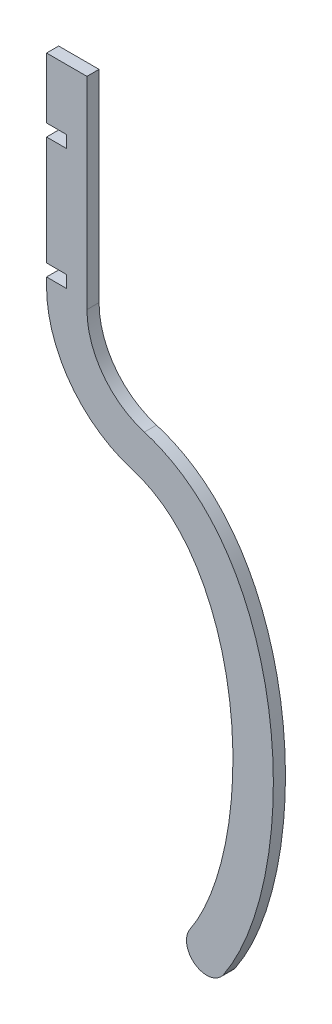
ISO-10303-21;
HEADER;
FILE_DESCRIPTION(('STEP AP214'),'2;1');
FILE_NAME('part.step','',(''),(''),'','','');
FILE_SCHEMA(('AUTOMOTIVE_DESIGN { 1 0 10303 214 1 1 1 1 }'));
ENDSEC;
DATA;
#1=APPLICATION_CONTEXT('core data for automotive mechanical design processes');
#2=APPLICATION_PROTOCOL_DEFINITION('international standard','automotive_design',2000,#1);
#3=PRODUCT_CONTEXT('',#1,'mechanical');
#4=PRODUCT('Part','Part','',(#3));
#5=PRODUCT_RELATED_PRODUCT_CATEGORY('part','',(#4));
#6=PRODUCT_DEFINITION_FORMATION('','',#4);
#7=PRODUCT_DEFINITION_CONTEXT('part definition',#1,'design');
#8=PRODUCT_DEFINITION('design','',#6,#7);
#9=PRODUCT_DEFINITION_SHAPE('','',#8);
#10=(LENGTH_UNIT() NAMED_UNIT(*) SI_UNIT(.MILLI.,.METRE.));
#11=(NAMED_UNIT(*) PLANE_ANGLE_UNIT() SI_UNIT($,.RADIAN.));
#12=(NAMED_UNIT(*) SI_UNIT($,.STERADIAN.) SOLID_ANGLE_UNIT());
#13=UNCERTAINTY_MEASURE_WITH_UNIT(LENGTH_MEASURE(1.E-05),#10,'distance_accuracy_value','');
#14=(GEOMETRIC_REPRESENTATION_CONTEXT(3) GLOBAL_UNCERTAINTY_ASSIGNED_CONTEXT((#13)) GLOBAL_UNIT_ASSIGNED_CONTEXT((#10,
#11,#12)) REPRESENTATION_CONTEXT('',''));
#15=CARTESIAN_POINT('',(0.,0.,0.));
#16=DIRECTION('',(0.,0.,1.));
#17=DIRECTION('',(1.,0.,0.));
#18=AXIS2_PLACEMENT_3D('',#15,#16,#17);
#19=CARTESIAN_POINT('',(74.0467315290024,-64.5312544209873,3.3));
#20=CARTESIAN_POINT('',(74.0467315289976,-64.5312544209945,3.20000000000001));
#21=CARTESIAN_POINT('',(74.0467315290022,-64.5312544209877,3.09999999999999));
#22=CARTESIAN_POINT('',(74.0467315290046,-64.5312544209842,2.00000000000009));
#23=CARTESIAN_POINT('',(74.0467315290024,-64.5312544209874,0.999999999999808));
#24=CARTESIAN_POINT('',(74.0467315290024,-64.5312544209874,-0.0999999999999823));
#25=CARTESIAN_POINT('',(74.0467315289981,-64.5312544209938,-0.200000000000011));
#26=CARTESIAN_POINT('',(74.0467315290024,-64.5312544209874,-0.3));
#27=CARTESIAN_POINT('',(68.4866590624211,-72.8425154908722,3.3));
#28=CARTESIAN_POINT('',(68.4866590624177,-72.8425154908452,3.19999999999999));
#29=CARTESIAN_POINT('',(68.486659062421,-72.8425154908706,3.10000000000001));
#30=CARTESIAN_POINT('',(68.486659062421,-72.8425154909087,1.99999999999987));
#31=CARTESIAN_POINT('',(68.4866590624211,-72.8425154908711,0.999999999999807));
#32=CARTESIAN_POINT('',(68.4866590624211,-72.8425154908711,-0.0999999999999827));
#33=CARTESIAN_POINT('',(68.4866590624128,-72.8425154908569,-0.20000000000001));
#34=CARTESIAN_POINT('',(68.4866590624211,-72.8425154908721,-0.3));
#35=CARTESIAN_POINT('',(60.1752958633945,-67.2825956911554,3.3));
#36=CARTESIAN_POINT('',(60.1752958634181,-67.2825956911443,3.19999999999999));
#37=CARTESIAN_POINT('',(60.1752958633963,-67.2825956911541,3.10000000000001));
#38=CARTESIAN_POINT('',(60.1752958633582,-67.282595691177,1.99999999999987));
#39=CARTESIAN_POINT('',(60.1752958633955,-67.2825956911548,0.999999999999809));
#40=CARTESIAN_POINT('',(60.1752958633955,-67.2825956911548,-0.0999999999999814));
#41=CARTESIAN_POINT('',(60.1752958634054,-67.2825956911442,-0.200000000000012));
#42=CARTESIAN_POINT('',(60.1752958633946,-67.2825956911553,-0.3));
#43=CARTESIAN_POINT('',(65.7350629943711,-58.9711303657911,3.3));
#44=CARTESIAN_POINT('',(65.7350629943658,-58.971130365799,3.20000000000001));
#45=CARTESIAN_POINT('',(65.7350629943709,-58.9711303657914,3.09999999999999));
#46=CARTESIAN_POINT('',(65.7350629943727,-58.9711303657888,2.00000000000009));
#47=CARTESIAN_POINT('',(65.7350629943711,-58.9711303657912,0.999999999999809));
#48=CARTESIAN_POINT('',(65.7350629943711,-58.9711303657912,-0.099999999999981));
#49=CARTESIAN_POINT('',(65.7350629943698,-58.971130365793,-0.200000000000012));
#50=CARTESIAN_POINT('',(65.7350629943711,-58.9711303657912,-0.3));
#51=(BOUNDED_SURFACE() B_SPLINE_SURFACE(3,3,((#19,#20,#21,#22,#23,#24,#25,#26),(#27,#28,#29,#30,
#31,#32,#33,#34),(#35,#36,#37,#38,#39,#40,#41,#42),(#43,#44,#45,#46,#47,#48,#49,#50)),
.UNSPECIFIED.,.F.,.F.,.F.) B_SPLINE_SURFACE_WITH_KNOTS((4,4),(4,2,2,4),(0.,1.),(-0.1,0.,1.,1.1),
.UNSPECIFIED.) GEOMETRIC_REPRESENTATION_ITEM() RATIONAL_B_SPLINE_SURFACE(((1.,1.,1.,1.,1.,1.,1.,
1.),(0.333345579042306,0.333345579042306,0.333345579042245,0.333345579042245,0.333345579042346,
0.333345579042346,0.333345579042311,0.333345579042311),(0.333345579042306,0.333345579042306,
0.333345579042245,0.333345579042245,0.333345579042346,0.333345579042346,0.333345579042311,
0.333345579042311),(1.,1.,1.,1.,1.,1.,1.,1.))) REPRESENTATION_ITEM('') SURFACE());
#52=CARTESIAN_POINT('',(65.7350629943711,-58.9711303657912,2.92300905702092E-13));
#53=DIRECTION('',(0.,0.,1.));
#54=VECTOR('',#53,1.);
#55=LINE('',#52,#54);
#56=CARTESIAN_POINT('',(65.7350629943711,-58.9711303657912,0.));
#57=VERTEX_POINT('',#56);
#58=CARTESIAN_POINT('',(65.7350629943711,-58.9711303657912,3.));
#59=VERTEX_POINT('',#58);
#60=EDGE_CURVE('E327',#57,#59,#55,.T.);
#61=CARTESIAN_POINT('',(65.7350629943711,-58.9711303657912,0.));
#62=CARTESIAN_POINT('',(60.1752958633955,-67.2825956911548,0.));
#63=CARTESIAN_POINT('',(68.4866590624211,-72.8425154908711,0.));
#64=CARTESIAN_POINT('',(74.0467315290024,-64.5312544209874,0.));
#65=(BOUNDED_CURVE() B_SPLINE_CURVE(3,(#61,#62,#63,#64),.UNSPECIFIED.,.F.,
.F.) B_SPLINE_CURVE_WITH_KNOTS((4,4),(0.,1.),
.UNSPECIFIED.) CURVE() GEOMETRIC_REPRESENTATION_ITEM() RATIONAL_B_SPLINE_CURVE((1.,
0.333345579042346,0.333345579042346,1.)) REPRESENTATION_ITEM(''));
#66=CARTESIAN_POINT('',(74.0467315290024,-64.5312544209874,0.));
#67=VERTEX_POINT('',#66);
#68=EDGE_CURVE('E54',#67,#57,#65,.F.);
#69=CARTESIAN_POINT('',(74.0467315290024,-64.5312544209874,2.99999999999987));
#70=DIRECTION('',(0.,0.,-1.));
#71=VECTOR('',#70,1.);
#72=LINE('',#69,#71);
#73=CARTESIAN_POINT('',(74.0467315290024,-64.5312544209874,3.));
#74=VERTEX_POINT('',#73);
#75=EDGE_CURVE('E407',#74,#67,#72,.T.);
#76=CARTESIAN_POINT('',(74.0467315290024,-64.5312544209874,3.));
#77=CARTESIAN_POINT('',(68.486659062421,-72.842515490874,3.));
#78=CARTESIAN_POINT('',(60.1752958633929,-67.2825956911561,3.));
#79=CARTESIAN_POINT('',(65.7350629943711,-58.9711303657912,3.));
#80=(BOUNDED_CURVE() B_SPLINE_CURVE(3,(#76,#77,#78,#79),.UNSPECIFIED.,.F.,
.F.) B_SPLINE_CURVE_WITH_KNOTS((4,4),(0.,1.),
.UNSPECIFIED.) CURVE() GEOMETRIC_REPRESENTATION_ITEM() RATIONAL_B_SPLINE_CURVE((1.,
0.333345579042245,0.333345579042245,1.)) REPRESENTATION_ITEM(''));
#81=EDGE_CURVE('E11',#59,#74,#80,.F.);
#82=ORIENTED_EDGE('',*,*,#60,.F.);
#83=ORIENTED_EDGE('',*,*,#68,.F.);
#84=ORIENTED_EDGE('',*,*,#75,.F.);
#85=ORIENTED_EDGE('',*,*,#81,.F.);
#86=EDGE_LOOP('',(#82,#83,#84,#85));
#87=FACE_BOUND('',#86,.T.);
#88=ADVANCED_FACE('F40',(#87),#51,.T.);
#89=CARTESIAN_POINT('',(30.2472330755642,111.105178128736,3.));
#90=DIRECTION('',(1.,0.,0.));
#91=DIRECTION('',(0.,1.,0.));
#92=AXIS2_PLACEMENT_3D('',#89,#90,#91);
#93=PLANE('',#92);
#94=DIRECTION('',(0.,0.,1.));
#95=VECTOR('',#94,1.);
#96=CARTESIAN_POINT('',(30.2472330755642,63.1051781287361,3.));
#97=LINE('',#96,#95);
#98=CARTESIAN_POINT('',(30.2472330755642,63.1051781287361,0.));
#99=VERTEX_POINT('',#98);
#100=CARTESIAN_POINT('',(30.2472330755642,63.1051781287361,3.));
#101=VERTEX_POINT('',#100);
#102=EDGE_CURVE('E267',#99,#101,#97,.T.);
#103=ORIENTED_EDGE('',*,*,#102,.F.);
#104=DIRECTION('',(0.,-1.,0.));
#105=VECTOR('',#104,1.);
#106=CARTESIAN_POINT('',(30.2472330755642,111.105178128736,0.));
#107=LINE('',#106,#105);
#108=CARTESIAN_POINT('',(30.2472330755642,61.1051781287361,0.));
#109=VERTEX_POINT('',#108);
#110=EDGE_CURVE('E433',#99,#109,#107,.T.);
#111=ORIENTED_EDGE('',*,*,#110,.T.);
#112=DIRECTION('',(0.,0.,-1.));
#113=VECTOR('',#112,1.);
#114=CARTESIAN_POINT('',(30.2472330755642,61.1051781287361,3.));
#115=LINE('',#114,#113);
#116=CARTESIAN_POINT('',(30.2472330755642,61.1051781287361,3.));
#117=VERTEX_POINT('',#116);
#118=EDGE_CURVE('E374',#117,#109,#115,.T.);
#119=ORIENTED_EDGE('',*,*,#118,.F.);
#120=DIRECTION('',(0.,-1.,0.));
#121=VECTOR('',#120,1.);
#122=CARTESIAN_POINT('',(30.2472330755642,111.105178128736,3.));
#123=LINE('',#122,#121);
#124=EDGE_CURVE('E286',#101,#117,#123,.T.);
#125=ORIENTED_EDGE('',*,*,#124,.F.);
#126=EDGE_LOOP('',(#103,#111,#119,#125));
#127=FACE_BOUND('',#126,.T.);
#128=ADVANCED_FACE('F491',(#127),#93,.F.);
#129=CARTESIAN_POINT('',(30.2472330755642,93.1051781287361,0.));
#130=VERTEX_POINT('',#129);
#131=CARTESIAN_POINT('',(30.2472330755642,66.1051781287361,0.));
#132=VERTEX_POINT('',#131);
#133=EDGE_CURVE('E431',#130,#132,#107,.T.);
#134=ORIENTED_EDGE('',*,*,#133,.T.);
#135=DIRECTION('',(0.,0.,1.));
#136=VECTOR('',#135,1.);
#137=CARTESIAN_POINT('',(30.2472330755642,66.1051781287361,3.));
#138=LINE('',#137,#136);
#139=CARTESIAN_POINT('',(30.2472330755642,66.1051781287361,3.));
#140=VERTEX_POINT('',#139);
#141=EDGE_CURVE('E274',#132,#140,#138,.T.);
#142=ORIENTED_EDGE('',*,*,#141,.T.);
#143=CARTESIAN_POINT('',(30.2472330755642,93.1051781287361,3.));
#144=VERTEX_POINT('',#143);
#145=EDGE_CURVE('E293',#144,#140,#123,.T.);
#146=ORIENTED_EDGE('',*,*,#145,.F.);
#147=DIRECTION('',(0.,0.,1.));
#148=VECTOR('',#147,1.);
#149=CARTESIAN_POINT('',(30.2472330755642,93.1051781287361,3.));
#150=LINE('',#149,#148);
#151=EDGE_CURVE('E219',#130,#144,#150,.T.);
#152=ORIENTED_EDGE('',*,*,#151,.F.);
#153=EDGE_LOOP('',(#134,#142,#146,#152));
#154=FACE_BOUND('',#153,.T.);
#155=ADVANCED_FACE('F483',(#154),#93,.F.);
#156=CARTESIAN_POINT('',(30.2472330755642,111.105178128736,3.));
#157=DIRECTION('',(0.,-1.,0.));
#158=DIRECTION('',(0.,0.,-1.));
#159=AXIS2_PLACEMENT_3D('',#156,#157,#158);
#160=PLANE('',#159);
#161=DIRECTION('',(-1.,0.,0.));
#162=VECTOR('',#161,1.);
#163=CARTESIAN_POINT('',(30.2472330755642,111.105178128736,0.));
#164=LINE('',#163,#162);
#165=CARTESIAN_POINT('',(40.2472330755642,111.105178128736,0.));
#166=VERTEX_POINT('',#165);
#167=CARTESIAN_POINT('',(30.2472330755642,111.105178128736,0.));
#168=VERTEX_POINT('',#167);
#169=EDGE_CURVE('E281',#166,#168,#164,.T.);
#170=ORIENTED_EDGE('',*,*,#169,.T.);
#171=DIRECTION('',(0.,0.,-1.));
#172=VECTOR('',#171,1.);
#173=CARTESIAN_POINT('',(30.2472330755642,111.105178128736,3.));
#174=LINE('',#173,#172);
#175=CARTESIAN_POINT('',(30.2472330755642,111.105178128736,3.));
#176=VERTEX_POINT('',#175);
#177=EDGE_CURVE('E378',#176,#168,#174,.T.);
#178=ORIENTED_EDGE('',*,*,#177,.F.);
#179=DIRECTION('',(-1.,0.,0.));
#180=VECTOR('',#179,1.);
#181=CARTESIAN_POINT('',(30.2472330755642,111.105178128736,3.));
#182=LINE('',#181,#180);
#183=CARTESIAN_POINT('',(40.2472330755642,111.105178128736,3.));
#184=VERTEX_POINT('',#183);
#185=EDGE_CURVE('E282',#184,#176,#182,.T.);
#186=ORIENTED_EDGE('',*,*,#185,.F.);
#187=DIRECTION('',(0.,0.,-1.));
#188=VECTOR('',#187,1.);
#189=CARTESIAN_POINT('',(40.2472330755642,111.105178128736,3.));
#190=LINE('',#189,#188);
#191=EDGE_CURVE('E357',#184,#166,#190,.T.);
#192=ORIENTED_EDGE('',*,*,#191,.T.);
#193=EDGE_LOOP('',(#170,#178,#186,#192));
#194=FACE_BOUND('',#193,.T.);
#195=ADVANCED_FACE('F458',(#194),#160,.F.);
#196=CARTESIAN_POINT('',(30.2472330755642,96.1051781287361,0.));
#197=VERTEX_POINT('',#196);
#198=EDGE_CURVE('E427',#168,#197,#107,.T.);
#199=ORIENTED_EDGE('',*,*,#198,.T.);
#200=DIRECTION('',(0.,0.,1.));
#201=VECTOR('',#200,1.);
#202=CARTESIAN_POINT('',(30.2472330755642,96.1051781287361,3.));
#203=LINE('',#202,#201);
#204=CARTESIAN_POINT('',(30.2472330755642,96.1051781287361,3.));
#205=VERTEX_POINT('',#204);
#206=EDGE_CURVE('E260',#197,#205,#203,.T.);
#207=ORIENTED_EDGE('',*,*,#206,.T.);
#208=EDGE_CURVE('E288',#176,#205,#123,.T.);
#209=ORIENTED_EDGE('',*,*,#208,.F.);
#210=ORIENTED_EDGE('',*,*,#177,.T.);
#211=EDGE_LOOP('',(#199,#207,#209,#210));
#212=FACE_BOUND('',#211,.T.);
#213=ADVANCED_FACE('F461',(#212),#93,.F.);
#214=CARTESIAN_POINT('',(60.2472330755642,61.1051781287361,3.));
#215=DIRECTION('',(0.,0.,-1.));
#216=DIRECTION('',(-1.,0.,0.));
#217=AXIS2_PLACEMENT_3D('',#214,#215,#216);
#218=CYLINDRICAL_SURFACE('',#217,30.);
#219=CARTESIAN_POINT('',(60.2472330755642,61.1051781287361,0.));
#220=DIRECTION('',(0.,0.,1.));
#221=DIRECTION('',(1.,0.,0.));
#222=AXIS2_PLACEMENT_3D('',#219,#220,#221);
#223=CIRCLE('',#222,30.);
#224=CARTESIAN_POINT('',(51.5783245461013,32.3849757459567,0.));
#225=VERTEX_POINT('',#224);
#226=EDGE_CURVE('E425',#109,#225,#223,.T.);
#227=ORIENTED_EDGE('',*,*,#226,.T.);
#228=DIRECTION('',(0.,0.,-1.));
#229=VECTOR('',#228,1.);
#230=CARTESIAN_POINT('',(51.5783245461013,32.3849757459567,3.));
#231=LINE('',#230,#229);
#232=CARTESIAN_POINT('',(51.5783245461013,32.3849757459567,3.));
#233=VERTEX_POINT('',#232);
#234=EDGE_CURVE('E370',#233,#225,#231,.T.);
#235=ORIENTED_EDGE('',*,*,#234,.F.);
#236=CARTESIAN_POINT('',(60.2472330755642,61.1051781287361,3.));
#237=DIRECTION('',(0.,0.,1.));
#238=DIRECTION('',(1.,0.,0.));
#239=AXIS2_PLACEMENT_3D('',#236,#237,#238);
#240=CIRCLE('',#239,30.);
#241=EDGE_CURVE('E292',#117,#233,#240,.T.);
#242=ORIENTED_EDGE('',*,*,#241,.F.);
#243=ORIENTED_EDGE('',*,*,#118,.T.);
#244=EDGE_LOOP('',(#227,#235,#242,#243));
#245=FACE_BOUND('',#244,.T.);
#246=ADVANCED_FACE('F493',(#245),#218,.T.);
#247=CARTESIAN_POINT('',(51.5783245461013,32.3849757459567,3.));
#248=CARTESIAN_POINT('',(52.4418237474786,32.1243370675715,3.));
#249=CARTESIAN_POINT('',(54.160244695127,31.5041732941851,3.));
#250=CARTESIAN_POINT('',(57.3068480949443,29.9703545295423,3.));
#251=CARTESIAN_POINT('',(60.9092601517179,27.4640028905668,3.));
#252=CARTESIAN_POINT('',(64.7789113425041,23.4878427324668,3.));
#253=CARTESIAN_POINT('',(69.3337224846496,16.8889121106159,3.));
#254=CARTESIAN_POINT('',(73.7131899847158,6.38380492162644,3.));
#255=CARTESIAN_POINT('',(76.4393028225739,-8.61752881826473,3.));
#256=CARTESIAN_POINT('',(76.5234079166854,-21.8927167166831,3.));
#257=CARTESIAN_POINT('',(75.3368048169374,-32.2481326739936,3.));
#258=CARTESIAN_POINT('',(73.8512799930039,-39.6983401019073,3.));
#259=CARTESIAN_POINT('',(71.8117544691769,-46.6469231762444,3.));
#260=CARTESIAN_POINT('',(69.6998429414444,-51.8638052622201,3.));
#261=CARTESIAN_POINT('',(67.8067562733463,-55.6012721850078,3.));
#262=CARTESIAN_POINT('',(66.2988758888052,-58.1660065714299,3.));
#263=CARTESIAN_POINT('',(64.9856806027951,-60.0849481600171,3.));
#264=CARTESIAN_POINT('',(63.9040927418651,-61.4887999643172,3.));
#265=CARTESIAN_POINT('',(63.3660237976318,-62.1329634196774,3.));
#266=CARTESIAN_POINT('',(63.0865626162944,-62.4536589435812,3.));
#267=B_SPLINE_CURVE_WITH_KNOTS('',3,(#247,#248,#249,#250,#251,#252,#253,#254,#255,#256,#257,
#258,#259,#260,#261,#262,#263,#264,#265,#266),.UNSPECIFIED.,.F.,.F.,(4,1,1,1,1,1,1,1,1,1,1,1,1,
1,1,1,1,4),(0.0736016129873298,0.102551562581476,0.131501512175622,0.189401411363914,
0.247301310552205,0.305201209740497,0.421001008117081,0.536800806493665,0.652600604870249,
0.710500504058541,0.768400403246832,0.826300302435124,0.884200201623416,0.913150151217562,
0.942100100811708,0.971050050405854,0.985525025202927,1.),.UNSPECIFIED.);
#268=DIRECTION('',(0.,0.,-1.));
#269=VECTOR('',#268,1.);
#270=SURFACE_OF_LINEAR_EXTRUSION('',#267,#269);
#271=CARTESIAN_POINT('',(51.5783245461013,32.3849757459567,0.));
#272=CARTESIAN_POINT('',(52.4418237474786,32.1243370675715,0.));
#273=CARTESIAN_POINT('',(54.160244695127,31.5041732941851,0.));
#274=CARTESIAN_POINT('',(57.3068480949443,29.9703545295423,0.));
#275=CARTESIAN_POINT('',(60.9092601517179,27.4640028905668,0.));
#276=CARTESIAN_POINT('',(64.7789113425041,23.4878427324668,0.));
#277=CARTESIAN_POINT('',(69.3337224846496,16.8889121106159,0.));
#278=CARTESIAN_POINT('',(73.7131899847158,6.38380492162644,0.));
#279=CARTESIAN_POINT('',(76.4393028225739,-8.61752881826473,0.));
#280=CARTESIAN_POINT('',(76.5234079166854,-21.8927167166831,0.));
#281=CARTESIAN_POINT('',(75.3368048169374,-32.2481326739936,0.));
#282=CARTESIAN_POINT('',(73.8512799930039,-39.6983401019073,0.));
#283=CARTESIAN_POINT('',(71.8117544691769,-46.6469231762444,0.));
#284=CARTESIAN_POINT('',(69.6998429414444,-51.8638052622201,0.));
#285=CARTESIAN_POINT('',(67.8067562733463,-55.6012721850078,0.));
#286=CARTESIAN_POINT('',(66.2988758888052,-58.1660065714299,0.));
#287=CARTESIAN_POINT('',(64.9856806027951,-60.0849481600171,0.));
#288=CARTESIAN_POINT('',(63.9040927418651,-61.4887999643172,0.));
#289=CARTESIAN_POINT('',(63.3660237976318,-62.1329634196774,0.));
#290=CARTESIAN_POINT('',(63.0865626162944,-62.4536589435812,0.));
#291=B_SPLINE_CURVE_WITH_KNOTS('',3,(#271,#272,#273,#274,#275,#276,#277,#278,#279,#280,#281,
#282,#283,#284,#285,#286,#287,#288,#289,#290),.UNSPECIFIED.,.F.,.F.,(4,1,1,1,1,1,1,1,1,1,1,1,1,
1,1,1,1,4),(0.0736016129873298,0.102551562581476,0.131501512175622,0.189401411363914,
0.247301310552205,0.305201209740497,0.421001008117081,0.536800806493665,0.652600604870249,
0.710500504058541,0.768400403246832,0.826300302435124,0.884200201623416,0.913150151217562,
0.942100100811708,0.971050050405854,0.985525025202927,1.),.UNSPECIFIED.);
#292=EDGE_CURVE('E319',#225,#57,#291,.T.);
#293=ORIENTED_EDGE('',*,*,#292,.T.);
#294=ORIENTED_EDGE('',*,*,#60,.T.);
#295=EDGE_CURVE('E296',#233,#59,#267,.T.);
#296=ORIENTED_EDGE('',*,*,#295,.F.);
#297=ORIENTED_EDGE('',*,*,#234,.T.);
#298=EDGE_LOOP('',(#293,#294,#296,#297));
#299=FACE_BOUND('',#298,.T.);
#300=ADVANCED_FACE('F310',(#299),#270,.F.);
#301=CARTESIAN_POINT('',(70.6256816408782,-69.0234142155192,3.));
#302=CARTESIAN_POINT('',(94.0603865040222,-42.1309316258111,3.));
#303=CARTESIAN_POINT('',(93.4691575994557,30.1862516868117,3.));
#304=CARTESIAN_POINT('',(54.4679607225889,41.9583765402165,3.));
#305=B_SPLINE_CURVE_WITH_KNOTS('',3,(#301,#302,#303,#304),.UNSPECIFIED.,.F.,.F.,(4,4),
(0.0736016129873298,1.),.UNSPECIFIED.);
#306=DIRECTION('',(0.,0.,-1.));
#307=VECTOR('',#306,1.);
#308=SURFACE_OF_LINEAR_EXTRUSION('',#305,#307);
#309=CARTESIAN_POINT('',(54.4679607225889,41.9583765402165,3.));
#310=VERTEX_POINT('',#309);
#311=EDGE_CURVE('E318',#74,#310,#305,.T.);
#312=ORIENTED_EDGE('',*,*,#311,.F.);
#313=ORIENTED_EDGE('',*,*,#75,.T.);
#314=CARTESIAN_POINT('',(70.6256816408782,-69.0234142155192,0.));
#315=CARTESIAN_POINT('',(94.0603865040222,-42.1309316258111,0.));
#316=CARTESIAN_POINT('',(93.4691575994557,30.1862516868117,0.));
#317=CARTESIAN_POINT('',(54.4679607225889,41.9583765402165,0.));
#318=B_SPLINE_CURVE_WITH_KNOTS('',3,(#314,#315,#316,#317),.UNSPECIFIED.,.F.,.F.,(4,4),
(0.0736016129873298,1.),.UNSPECIFIED.);
#319=CARTESIAN_POINT('',(54.4679607225889,41.9583765402165,0.));
#320=VERTEX_POINT('',#319);
#321=EDGE_CURVE('E331',#67,#320,#318,.T.);
#322=ORIENTED_EDGE('',*,*,#321,.T.);
#323=DIRECTION('',(0.,0.,-1.));
#324=VECTOR('',#323,1.);
#325=CARTESIAN_POINT('',(54.4679607225889,41.9583765402165,3.));
#326=LINE('',#325,#324);
#327=EDGE_CURVE('E366',#310,#320,#326,.T.);
#328=ORIENTED_EDGE('',*,*,#327,.F.);
#329=EDGE_LOOP('',(#312,#313,#322,#328));
#330=FACE_BOUND('',#329,.T.);
#331=ADVANCED_FACE('F446',(#330),#308,.F.);
#332=CARTESIAN_POINT('',(60.2472330755642,61.1051781287361,3.));
#333=DIRECTION('',(0.,0.,-1.));
#334=DIRECTION('',(-1.,0.,0.));
#335=AXIS2_PLACEMENT_3D('',#332,#333,#334);
#336=CYLINDRICAL_SURFACE('',#335,20.);
#337=CARTESIAN_POINT('',(60.2472330755642,61.1051781287361,0.));
#338=DIRECTION('',(0.,0.,-1.));
#339=DIRECTION('',(1.,0.,0.));
#340=AXIS2_PLACEMENT_3D('',#337,#338,#339);
#341=CIRCLE('',#340,20.);
#342=CARTESIAN_POINT('',(40.2472330755642,61.1051781287361,0.));
#343=VERTEX_POINT('',#342);
#344=EDGE_CURVE('E340',#320,#343,#341,.T.);
#345=ORIENTED_EDGE('',*,*,#344,.T.);
#346=DIRECTION('',(0.,0.,-1.));
#347=VECTOR('',#346,1.);
#348=CARTESIAN_POINT('',(40.2472330755642,61.1051781287361,3.));
#349=LINE('',#348,#347);
#350=CARTESIAN_POINT('',(40.2472330755642,61.1051781287361,3.));
#351=VERTEX_POINT('',#350);
#352=EDGE_CURVE('E361',#351,#343,#349,.T.);
#353=ORIENTED_EDGE('',*,*,#352,.F.);
#354=CARTESIAN_POINT('',(60.2472330755642,61.1051781287361,3.));
#355=DIRECTION('',(0.,0.,-1.));
#356=DIRECTION('',(1.,0.,0.));
#357=AXIS2_PLACEMENT_3D('',#354,#355,#356);
#358=CIRCLE('',#357,20.);
#359=EDGE_CURVE('E439',#310,#351,#358,.T.);
#360=ORIENTED_EDGE('',*,*,#359,.F.);
#361=ORIENTED_EDGE('',*,*,#327,.T.);
#362=EDGE_LOOP('',(#345,#353,#360,#361));
#363=FACE_BOUND('',#362,.T.);
#364=ADVANCED_FACE('F448',(#363),#336,.F.);
#365=CARTESIAN_POINT('',(40.2472330755642,111.105178128736,3.));
#366=DIRECTION('',(-1.,0.,0.));
#367=DIRECTION('',(0.,-1.,0.));
#368=AXIS2_PLACEMENT_3D('',#365,#366,#367);
#369=PLANE('',#368);
#370=DIRECTION('',(0.,1.,0.));
#371=VECTOR('',#370,1.);
#372=CARTESIAN_POINT('',(40.2472330755642,111.105178128736,0.));
#373=LINE('',#372,#371);
#374=EDGE_CURVE('E287',#343,#166,#373,.T.);
#375=ORIENTED_EDGE('',*,*,#374,.T.);
#376=ORIENTED_EDGE('',*,*,#191,.F.);
#377=DIRECTION('',(0.,1.,0.));
#378=VECTOR('',#377,1.);
#379=CARTESIAN_POINT('',(40.2472330755642,111.105178128736,3.));
#380=LINE('',#379,#378);
#381=EDGE_CURVE('E362',#351,#184,#380,.T.);
#382=ORIENTED_EDGE('',*,*,#381,.F.);
#383=ORIENTED_EDGE('',*,*,#352,.T.);
#384=EDGE_LOOP('',(#375,#376,#382,#383));
#385=FACE_BOUND('',#384,.T.);
#386=ADVANCED_FACE('F453',(#385),#369,.F.);
#387=CARTESIAN_POINT('',(60.2472330755642,61.1051781287361,3.));
#388=DIRECTION('',(0.,0.,1.));
#389=DIRECTION('',(1.,0.,0.));
#390=AXIS2_PLACEMENT_3D('',#387,#388,#389);
#391=PLANE('',#390);
#392=ORIENTED_EDGE('',*,*,#295,.T.);
#393=ORIENTED_EDGE('',*,*,#81,.T.);
#394=ORIENTED_EDGE('',*,*,#311,.T.);
#395=ORIENTED_EDGE('',*,*,#359,.T.);
#396=ORIENTED_EDGE('',*,*,#381,.T.);
#397=ORIENTED_EDGE('',*,*,#185,.T.);
#398=ORIENTED_EDGE('',*,*,#208,.T.);
#399=DIRECTION('',(-1.,0.,0.));
#400=VECTOR('',#399,1.);
#401=CARTESIAN_POINT('',(60.2472330755642,96.1051781287361,3.));
#402=LINE('',#401,#400);
#403=CARTESIAN_POINT('',(35.2472330755639,96.1051781287361,2.99999999999982));
#404=VERTEX_POINT('',#403);
#405=EDGE_CURVE('E264',#404,#205,#402,.T.);
#406=ORIENTED_EDGE('',*,*,#405,.F.);
#407=DIRECTION('',(0.,1.,0.));
#408=VECTOR('',#407,1.);
#409=CARTESIAN_POINT('',(35.2472330755639,93.1041781287361,2.99999999999982));
#410=LINE('',#409,#408);
#411=CARTESIAN_POINT('',(35.2472330755639,93.1051781287361,2.99999999999982));
#412=VERTEX_POINT('',#411);
#413=EDGE_CURVE('E238',#412,#404,#410,.T.);
#414=ORIENTED_EDGE('',*,*,#413,.F.);
#415=DIRECTION('',(-1.,0.,0.));
#416=VECTOR('',#415,1.);
#417=CARTESIAN_POINT('',(60.2472330755642,93.1051781287361,3.));
#418=LINE('',#417,#416);
#419=EDGE_CURVE('E256',#412,#144,#418,.T.);
#420=ORIENTED_EDGE('',*,*,#419,.T.);
#421=ORIENTED_EDGE('',*,*,#145,.T.);
#422=DIRECTION('',(-1.,0.,0.));
#423=VECTOR('',#422,1.);
#424=CARTESIAN_POINT('',(60.2472330755642,66.1051781287361,3.));
#425=LINE('',#424,#423);
#426=CARTESIAN_POINT('',(35.2472330755642,66.1051781287361,3.));
#427=VERTEX_POINT('',#426);
#428=EDGE_CURVE('E278',#427,#140,#425,.T.);
#429=ORIENTED_EDGE('',*,*,#428,.F.);
#430=DIRECTION('',(0.,1.,0.));
#431=VECTOR('',#430,1.);
#432=CARTESIAN_POINT('',(35.2472330755642,63.1041781287361,3.));
#433=LINE('',#432,#431);
#434=CARTESIAN_POINT('',(35.2472330755642,63.1051781287361,3.));
#435=VERTEX_POINT('',#434);
#436=EDGE_CURVE('E194',#435,#427,#433,.T.);
#437=ORIENTED_EDGE('',*,*,#436,.F.);
#438=DIRECTION('',(-1.,0.,0.));
#439=VECTOR('',#438,1.);
#440=CARTESIAN_POINT('',(60.2472330755642,63.1051781287361,3.));
#441=LINE('',#440,#439);
#442=EDGE_CURVE('E270',#435,#101,#441,.T.);
#443=ORIENTED_EDGE('',*,*,#442,.T.);
#444=ORIENTED_EDGE('',*,*,#124,.T.);
#445=ORIENTED_EDGE('',*,*,#241,.T.);
#446=EDGE_LOOP('',(#392,#393,#394,#395,#396,#397,#398,#406,#414,#420,#421,#429,#437,#443,#444,#445));
#447=FACE_BOUND('',#446,.T.);
#448=ADVANCED_FACE('F445',(#447),#391,.T.);
#449=CARTESIAN_POINT('',(60.2472330755642,61.1051781287361,0.));
#450=DIRECTION('',(0.,0.,1.));
#451=DIRECTION('',(1.,0.,0.));
#452=AXIS2_PLACEMENT_3D('',#449,#450,#451);
#453=PLANE('',#452);
#454=ORIENTED_EDGE('',*,*,#321,.F.);
#455=ORIENTED_EDGE('',*,*,#68,.T.);
#456=ORIENTED_EDGE('',*,*,#292,.F.);
#457=ORIENTED_EDGE('',*,*,#226,.F.);
#458=ORIENTED_EDGE('',*,*,#110,.F.);
#459=DIRECTION('',(-1.,0.,0.));
#460=VECTOR('',#459,1.);
#461=CARTESIAN_POINT('',(60.2472330755642,63.1051781287361,0.));
#462=LINE('',#461,#460);
#463=CARTESIAN_POINT('',(40.2152202653009,63.1051781287361,0.));
#464=VERTEX_POINT('',#463);
#465=EDGE_CURVE('E393',#464,#99,#462,.T.);
#466=ORIENTED_EDGE('',*,*,#465,.F.);
#467=DIRECTION('',(0.,-1.,0.));
#468=VECTOR('',#467,1.);
#469=CARTESIAN_POINT('',(40.2152202653009,66.1051781287361,0.));
#470=LINE('',#469,#468);
#471=CARTESIAN_POINT('',(40.2152202653009,66.1051781287361,0.));
#472=VERTEX_POINT('',#471);
#473=EDGE_CURVE('E396',#472,#464,#470,.T.);
#474=ORIENTED_EDGE('',*,*,#473,.F.);
#475=DIRECTION('',(-1.,0.,0.));
#476=VECTOR('',#475,1.);
#477=CARTESIAN_POINT('',(60.2472330755642,66.1051781287361,0.));
#478=LINE('',#477,#476);
#479=EDGE_CURVE('E399',#472,#132,#478,.T.);
#480=ORIENTED_EDGE('',*,*,#479,.T.);
#481=ORIENTED_EDGE('',*,*,#133,.F.);
#482=DIRECTION('',(-1.,0.,0.));
#483=VECTOR('',#482,1.);
#484=CARTESIAN_POINT('',(60.2472330755642,93.1051781287361,0.));
#485=LINE('',#484,#483);
#486=CARTESIAN_POINT('',(40.2152202653006,93.1051781287361,0.));
#487=VERTEX_POINT('',#486);
#488=EDGE_CURVE('E382',#487,#130,#485,.T.);
#489=ORIENTED_EDGE('',*,*,#488,.F.);
#490=DIRECTION('',(0.,-1.,0.));
#491=VECTOR('',#490,1.);
#492=CARTESIAN_POINT('',(40.2152202653006,96.1051781287361,0.));
#493=LINE('',#492,#491);
#494=CARTESIAN_POINT('',(40.2152202653006,96.1051781287361,0.));
#495=VERTEX_POINT('',#494);
#496=EDGE_CURVE('E385',#495,#487,#493,.T.);
#497=ORIENTED_EDGE('',*,*,#496,.F.);
#498=DIRECTION('',(-1.,0.,0.));
#499=VECTOR('',#498,1.);
#500=CARTESIAN_POINT('',(60.2472330755642,96.1051781287361,0.));
#501=LINE('',#500,#499);
#502=EDGE_CURVE('E389',#495,#197,#501,.T.);
#503=ORIENTED_EDGE('',*,*,#502,.T.);
#504=ORIENTED_EDGE('',*,*,#198,.F.);
#505=ORIENTED_EDGE('',*,*,#169,.F.);
#506=ORIENTED_EDGE('',*,*,#374,.F.);
#507=ORIENTED_EDGE('',*,*,#344,.F.);
#508=EDGE_LOOP('',(#454,#455,#456,#457,#458,#466,#474,#480,#481,#489,#497,#503,#504,#505,#506,#507));
#509=FACE_BOUND('',#508,.T.);
#510=ADVANCED_FACE('F415',(#509),#453,.F.);
#511=CARTESIAN_POINT('',(0.247233075551134,96.1051781287361,1.6000000000065));
#512=DIRECTION('',(0.,-1.,0.));
#513=DIRECTION('',(0.5,0.,-0.866025403784439));
#514=AXIS2_PLACEMENT_3D('',#511,#512,#513);
#515=CYLINDRICAL_SURFACE('',#514,40.);
#516=ORIENTED_EDGE('',*,*,#496,.T.);
#517=CARTESIAN_POINT('',(0.247233075551134,93.1051781287361,1.6000000000065));
#518=DIRECTION('',(0.,1.,0.));
#519=DIRECTION('',(-0.5,0.,0.866025403784439));
#520=AXIS2_PLACEMENT_3D('',#517,#518,#519);
#521=CIRCLE('',#520,40.);
#522=CARTESIAN_POINT('',(40.2227255678267,93.1051781287361,0.199999999999815));
#523=VERTEX_POINT('',#522);
#524=EDGE_CURVE('E246',#523,#487,#521,.T.);
#525=ORIENTED_EDGE('',*,*,#524,.F.);
#526=DIRECTION('',(0.,-1.,0.));
#527=VECTOR('',#526,1.);
#528=CARTESIAN_POINT('',(40.2227255678267,96.1051781287361,0.199999999999815));
#529=LINE('',#528,#527);
#530=CARTESIAN_POINT('',(40.2227255678267,96.1051781287361,0.199999999999815));
#531=VERTEX_POINT('',#530);
#532=EDGE_CURVE('E222',#523,#531,#529,.F.);
#533=ORIENTED_EDGE('',*,*,#532,.T.);
#534=CARTESIAN_POINT('',(0.247233075551134,96.1051781287361,1.6000000000065));
#535=DIRECTION('',(0.,1.,0.));
#536=DIRECTION('',(-0.5,0.,0.866025403784439));
#537=AXIS2_PLACEMENT_3D('',#534,#535,#536);
#538=CIRCLE('',#537,40.);
#539=EDGE_CURVE('E247',#531,#495,#538,.T.);
#540=ORIENTED_EDGE('',*,*,#539,.T.);
#541=EDGE_LOOP('',(#516,#525,#533,#540));
#542=FACE_BOUND('',#541,.T.);
#543=ADVANCED_FACE('F469',(#542),#515,.F.);
#544=CARTESIAN_POINT('',(0.247233075551134,96.1051781287361,1.6000000000065));
#545=DIRECTION('',(0.,1.,0.));
#546=DIRECTION('',(-0.5,0.,0.866025403784439));
#547=AXIS2_PLACEMENT_3D('',#544,#545,#546);
#548=PLANE('',#547);
#549=ORIENTED_EDGE('',*,*,#405,.T.);
#550=ORIENTED_EDGE('',*,*,#206,.F.);
#551=ORIENTED_EDGE('',*,*,#502,.F.);
#552=ORIENTED_EDGE('',*,*,#539,.F.);
#553=DIRECTION('',(-1.,0.,0.));
#554=VECTOR('',#553,1.);
#555=CARTESIAN_POINT('',(40.2472330755639,96.1051781287361,0.199999999999815));
#556=LINE('',#555,#554);
#557=CARTESIAN_POINT('',(35.2472330755639,96.1051781287361,0.19999999999982));
#558=VERTEX_POINT('',#557);
#559=EDGE_CURVE('E229',#531,#558,#556,.T.);
#560=ORIENTED_EDGE('',*,*,#559,.T.);
#561=DIRECTION('',(0.,0.,1.));
#562=VECTOR('',#561,1.);
#563=CARTESIAN_POINT('',(35.2472330755639,96.1051781287361,2.99999999999982));
#564=LINE('',#563,#562);
#565=EDGE_CURVE('E233',#558,#404,#564,.T.);
#566=ORIENTED_EDGE('',*,*,#565,.T.);
#567=EDGE_LOOP('',(#549,#550,#551,#552,#560,#566));
#568=FACE_BOUND('',#567,.T.);
#569=ADVANCED_FACE('F463',(#568),#548,.F.);
#570=CARTESIAN_POINT('',(0.247233075551134,93.1051781287361,1.6000000000065));
#571=DIRECTION('',(0.,1.,0.));
#572=DIRECTION('',(-0.5,0.,0.866025403784439));
#573=AXIS2_PLACEMENT_3D('',#570,#571,#572);
#574=PLANE('',#573);
#575=DIRECTION('',(0.,0.,-1.));
#576=VECTOR('',#575,1.);
#577=CARTESIAN_POINT('',(35.2472330755639,93.1051781287361,2.99999999999982));
#578=LINE('',#577,#576);
#579=CARTESIAN_POINT('',(35.2472330755639,93.1051781287361,0.19999999999982));
#580=VERTEX_POINT('',#579);
#581=EDGE_CURVE('E225',#412,#580,#578,.T.);
#582=ORIENTED_EDGE('',*,*,#581,.T.);
#583=DIRECTION('',(1.,0.,0.));
#584=VECTOR('',#583,1.);
#585=CARTESIAN_POINT('',(40.2472330755639,93.1051781287361,0.199999999999815));
#586=LINE('',#585,#584);
#587=EDGE_CURVE('E241',#580,#523,#586,.T.);
#588=ORIENTED_EDGE('',*,*,#587,.T.);
#589=ORIENTED_EDGE('',*,*,#524,.T.);
#590=ORIENTED_EDGE('',*,*,#488,.T.);
#591=ORIENTED_EDGE('',*,*,#151,.T.);
#592=ORIENTED_EDGE('',*,*,#419,.F.);
#593=EDGE_LOOP('',(#582,#588,#589,#590,#591,#592));
#594=FACE_BOUND('',#593,.T.);
#595=ADVANCED_FACE('F538',(#594),#574,.T.);
#596=CARTESIAN_POINT('',(35.2472330755639,93.1041781287361,2.99999999999982));
#597=DIRECTION('',(-1.,0.,0.));
#598=DIRECTION('',(0.,0.,1.));
#599=AXIS2_PLACEMENT_3D('',#596,#597,#598);
#600=PLANE('',#599);
#601=ORIENTED_EDGE('',*,*,#581,.F.);
#602=ORIENTED_EDGE('',*,*,#413,.T.);
#603=ORIENTED_EDGE('',*,*,#565,.F.);
#604=DIRECTION('',(0.,1.,0.));
#605=VECTOR('',#604,1.);
#606=CARTESIAN_POINT('',(35.2472330755639,93.1041781287361,0.19999999999982));
#607=LINE('',#606,#605);
#608=EDGE_CURVE('E237',#580,#558,#607,.T.);
#609=ORIENTED_EDGE('',*,*,#608,.F.);
#610=EDGE_LOOP('',(#601,#602,#603,#609));
#611=FACE_BOUND('',#610,.T.);
#612=ADVANCED_FACE('F476',(#611),#600,.T.);
#613=CARTESIAN_POINT('',(40.2472330755639,93.1041781287361,0.199999999999815));
#614=DIRECTION('',(0.,0.,-1.));
#615=DIRECTION('',(-1.,0.,0.));
#616=AXIS2_PLACEMENT_3D('',#613,#614,#615);
#617=PLANE('',#616);
#618=ORIENTED_EDGE('',*,*,#587,.F.);
#619=ORIENTED_EDGE('',*,*,#608,.T.);
#620=ORIENTED_EDGE('',*,*,#559,.F.);
#621=ORIENTED_EDGE('',*,*,#532,.F.);
#622=EDGE_LOOP('',(#618,#619,#620,#621));
#623=FACE_BOUND('',#622,.T.);
#624=ADVANCED_FACE('F555',(#623),#617,.T.);
#625=CARTESIAN_POINT('',(0.247233075551426,66.1051781287361,1.60000000000668));
#626=DIRECTION('',(0.,-1.,0.));
#627=DIRECTION('',(0.5,0.,-0.866025403784439));
#628=AXIS2_PLACEMENT_3D('',#625,#626,#627);
#629=CYLINDRICAL_SURFACE('',#628,40.);
#630=ORIENTED_EDGE('',*,*,#473,.T.);
#631=CARTESIAN_POINT('',(0.247233075551426,63.1051781287361,1.60000000000668));
#632=DIRECTION('',(0.,1.,0.));
#633=DIRECTION('',(-0.5,0.,0.866025403784439));
#634=AXIS2_PLACEMENT_3D('',#631,#632,#633);
#635=CIRCLE('',#634,40.);
#636=CARTESIAN_POINT('',(40.222725567827,63.1051781287361,0.199999999999995));
#637=VERTEX_POINT('',#636);
#638=EDGE_CURVE('E216',#637,#464,#635,.T.);
#639=ORIENTED_EDGE('',*,*,#638,.F.);
#640=DIRECTION('',(0.,-1.,0.));
#641=VECTOR('',#640,1.);
#642=CARTESIAN_POINT('',(40.222725567827,66.1051781287361,0.199999999999995));
#643=LINE('',#642,#641);
#644=CARTESIAN_POINT('',(40.222725567827,66.1051781287361,0.199999999999995));
#645=VERTEX_POINT('',#644);
#646=EDGE_CURVE('E251',#637,#645,#643,.F.);
#647=ORIENTED_EDGE('',*,*,#646,.T.);
#648=CARTESIAN_POINT('',(0.247233075551426,66.1051781287361,1.60000000000668));
#649=DIRECTION('',(0.,1.,0.));
#650=DIRECTION('',(-0.5,0.,0.866025403784439));
#651=AXIS2_PLACEMENT_3D('',#648,#649,#650);
#652=CIRCLE('',#651,40.);
#653=EDGE_CURVE('E202',#645,#472,#652,.T.);
#654=ORIENTED_EDGE('',*,*,#653,.T.);
#655=EDGE_LOOP('',(#630,#639,#647,#654));
#656=FACE_BOUND('',#655,.T.);
#657=ADVANCED_FACE('F564',(#656),#629,.F.);
#658=CARTESIAN_POINT('',(0.247233075551426,66.1051781287361,1.60000000000668));
#659=DIRECTION('',(0.,1.,0.));
#660=DIRECTION('',(-0.5,0.,0.866025403784439));
#661=AXIS2_PLACEMENT_3D('',#658,#659,#660);
#662=PLANE('',#661);
#663=ORIENTED_EDGE('',*,*,#428,.T.);
#664=ORIENTED_EDGE('',*,*,#141,.F.);
#665=ORIENTED_EDGE('',*,*,#479,.F.);
#666=ORIENTED_EDGE('',*,*,#653,.F.);
#667=DIRECTION('',(-1.,0.,0.));
#668=VECTOR('',#667,1.);
#669=CARTESIAN_POINT('',(40.2472330755642,66.1051781287361,0.199999999999995));
#670=LINE('',#669,#668);
#671=CARTESIAN_POINT('',(35.2472330755642,66.1051781287361,0.200000000000001));
#672=VERTEX_POINT('',#671);
#673=EDGE_CURVE('E186',#645,#672,#670,.T.);
#674=ORIENTED_EDGE('',*,*,#673,.T.);
#675=DIRECTION('',(0.,0.,1.));
#676=VECTOR('',#675,1.);
#677=CARTESIAN_POINT('',(35.2472330755642,66.1051781287361,3.));
#678=LINE('',#677,#676);
#679=EDGE_CURVE('E195',#672,#427,#678,.T.);
#680=ORIENTED_EDGE('',*,*,#679,.T.);
#681=EDGE_LOOP('',(#663,#664,#665,#666,#674,#680));
#682=FACE_BOUND('',#681,.T.);
#683=ADVANCED_FACE('F199',(#682),#662,.F.);
#684=CARTESIAN_POINT('',(0.247233075551426,63.1051781287361,1.60000000000668));
#685=DIRECTION('',(0.,1.,0.));
#686=DIRECTION('',(-0.5,0.,0.866025403784439));
#687=AXIS2_PLACEMENT_3D('',#684,#685,#686);
#688=PLANE('',#687);
#689=DIRECTION('',(0.,0.,-1.));
#690=VECTOR('',#689,1.);
#691=CARTESIAN_POINT('',(35.2472330755642,63.1051781287361,3.));
#692=LINE('',#691,#690);
#693=CARTESIAN_POINT('',(35.2472330755642,63.1051781287361,0.200000000000001));
#694=VERTEX_POINT('',#693);
#695=EDGE_CURVE('E204',#435,#694,#692,.T.);
#696=ORIENTED_EDGE('',*,*,#695,.T.);
#697=DIRECTION('',(1.,0.,0.));
#698=VECTOR('',#697,1.);
#699=CARTESIAN_POINT('',(40.2472330755642,63.1051781287361,0.199999999999995));
#700=LINE('',#699,#698);
#701=EDGE_CURVE('E188',#694,#637,#700,.T.);
#702=ORIENTED_EDGE('',*,*,#701,.T.);
#703=ORIENTED_EDGE('',*,*,#638,.T.);
#704=ORIENTED_EDGE('',*,*,#465,.T.);
#705=ORIENTED_EDGE('',*,*,#102,.T.);
#706=ORIENTED_EDGE('',*,*,#442,.F.);
#707=EDGE_LOOP('',(#696,#702,#703,#704,#705,#706));
#708=FACE_BOUND('',#707,.T.);
#709=ADVANCED_FACE('F582',(#708),#688,.T.);
#710=CARTESIAN_POINT('',(35.2472330755642,63.1041781287361,3.));
#711=DIRECTION('',(-1.,0.,0.));
#712=DIRECTION('',(0.,0.,1.));
#713=AXIS2_PLACEMENT_3D('',#710,#711,#712);
#714=PLANE('',#713);
#715=ORIENTED_EDGE('',*,*,#695,.F.);
#716=ORIENTED_EDGE('',*,*,#436,.T.);
#717=ORIENTED_EDGE('',*,*,#679,.F.);
#718=DIRECTION('',(0.,1.,0.));
#719=VECTOR('',#718,1.);
#720=CARTESIAN_POINT('',(35.2472330755642,63.1041781287361,0.200000000000001));
#721=LINE('',#720,#719);
#722=EDGE_CURVE('E182',#694,#672,#721,.T.);
#723=ORIENTED_EDGE('',*,*,#722,.F.);
#724=EDGE_LOOP('',(#715,#716,#717,#723));
#725=FACE_BOUND('',#724,.T.);
#726=ADVANCED_FACE('F206',(#725),#714,.T.);
#727=CARTESIAN_POINT('',(40.2472330755642,63.1041781287361,0.199999999999995));
#728=DIRECTION('',(0.,0.,-1.));
#729=DIRECTION('',(-1.,0.,0.));
#730=AXIS2_PLACEMENT_3D('',#727,#728,#729);
#731=PLANE('',#730);
#732=ORIENTED_EDGE('',*,*,#701,.F.);
#733=ORIENTED_EDGE('',*,*,#722,.T.);
#734=ORIENTED_EDGE('',*,*,#673,.F.);
#735=ORIENTED_EDGE('',*,*,#646,.F.);
#736=EDGE_LOOP('',(#732,#733,#734,#735));
#737=FACE_BOUND('',#736,.T.);
#738=ADVANCED_FACE('F184',(#737),#731,.T.);
#739=CLOSED_SHELL('',(#88,#128,#155,#195,#213,#246,#300,#331,#364,#386,#448,#510,#543,#569,#595,
#612,#624,#657,#683,#709,#726,#738));
#740=MANIFOLD_SOLID_BREP('B2',#739);
#741=ADVANCED_BREP_SHAPE_REPRESENTATION('',(#18,#740),#14);
#742=SHAPE_DEFINITION_REPRESENTATION(#9,#741);
ENDSEC;
END-ISO-10303-21;
